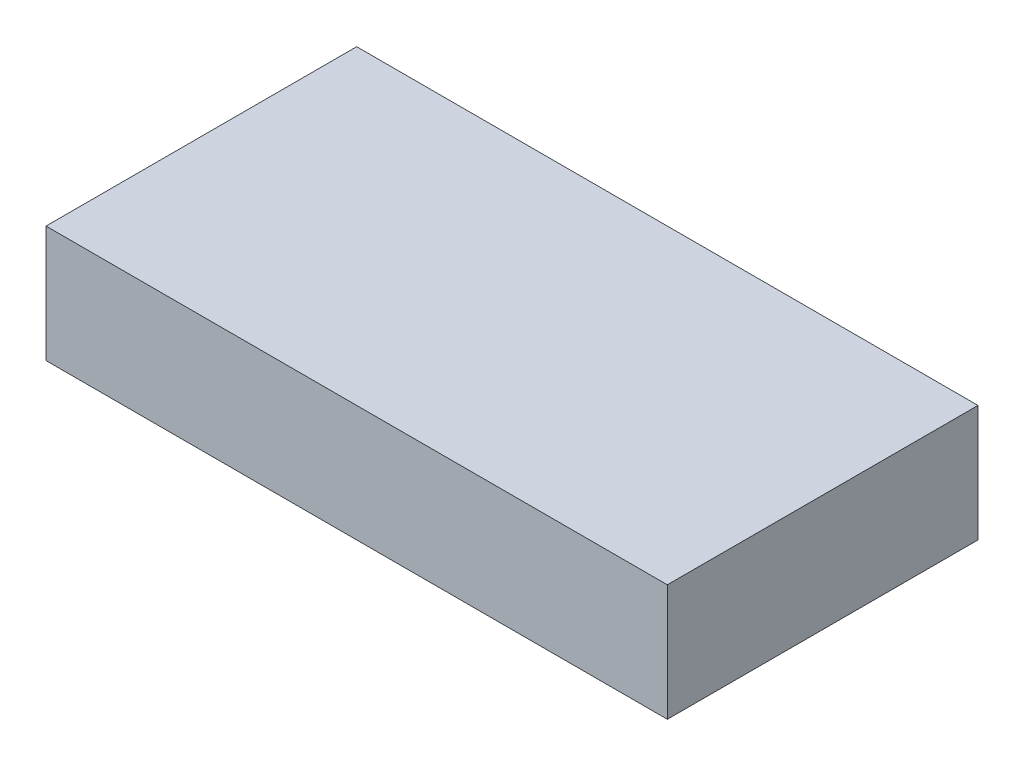
ISO-10303-21;
HEADER;
FILE_DESCRIPTION(('STEP AP214'),'2;1');
FILE_NAME('part.step','',(''),(''),'','','');
FILE_SCHEMA(('AUTOMOTIVE_DESIGN { 1 0 10303 214 1 1 1 1 }'));
ENDSEC;
DATA;
#1=APPLICATION_CONTEXT('core data for automotive mechanical design processes');
#2=APPLICATION_PROTOCOL_DEFINITION('international standard','automotive_design',2000,#1);
#3=PRODUCT_CONTEXT('',#1,'mechanical');
#4=PRODUCT('Part','Part','',(#3));
#5=PRODUCT_RELATED_PRODUCT_CATEGORY('part','',(#4));
#6=PRODUCT_DEFINITION_FORMATION('','',#4);
#7=PRODUCT_DEFINITION_CONTEXT('part definition',#1,'design');
#8=PRODUCT_DEFINITION('design','',#6,#7);
#9=PRODUCT_DEFINITION_SHAPE('','',#8);
#10=(LENGTH_UNIT() NAMED_UNIT(*) SI_UNIT(.MILLI.,.METRE.));
#11=(NAMED_UNIT(*) PLANE_ANGLE_UNIT() SI_UNIT($,.RADIAN.));
#12=(NAMED_UNIT(*) SI_UNIT($,.STERADIAN.) SOLID_ANGLE_UNIT());
#13=UNCERTAINTY_MEASURE_WITH_UNIT(LENGTH_MEASURE(1.E-05),#10,'distance_accuracy_value','');
#14=(GEOMETRIC_REPRESENTATION_CONTEXT(3) GLOBAL_UNCERTAINTY_ASSIGNED_CONTEXT((#13)) GLOBAL_UNIT_ASSIGNED_CONTEXT((#10,
#11,#12)) REPRESENTATION_CONTEXT('',''));
#15=CARTESIAN_POINT('',(0.,0.,0.));
#16=DIRECTION('',(0.,0.,1.));
#17=DIRECTION('',(1.,0.,0.));
#18=AXIS2_PLACEMENT_3D('',#15,#16,#17);
#19=CARTESIAN_POINT('',(0.,-19.05,0.));
#20=DIRECTION('',(-1.,0.,0.));
#21=DIRECTION('',(0.,0.,1.));
#22=AXIS2_PLACEMENT_3D('',#19,#20,#21);
#23=PLANE('',#22);
#24=DIRECTION('',(0.,0.,1.));
#25=VECTOR('',#24,1.);
#26=CARTESIAN_POINT('',(0.,0.,0.));
#27=LINE('',#26,#25);
#28=CARTESIAN_POINT('',(0.,0.,-50.8));
#29=VERTEX_POINT('',#28);
#30=CARTESIAN_POINT('',(0.,0.,0.));
#31=VERTEX_POINT('',#30);
#32=EDGE_CURVE('E95',#29,#31,#27,.T.);
#33=ORIENTED_EDGE('',*,*,#32,.F.);
#34=DIRECTION('',(0.,1.,0.));
#35=VECTOR('',#34,1.);
#36=CARTESIAN_POINT('',(0.,-19.05,-50.8));
#37=LINE('',#36,#35);
#38=CARTESIAN_POINT('',(0.,-19.05,-50.8));
#39=VERTEX_POINT('',#38);
#40=EDGE_CURVE('E11',#39,#29,#37,.T.);
#41=ORIENTED_EDGE('',*,*,#40,.F.);
#42=DIRECTION('',(0.,0.,1.));
#43=VECTOR('',#42,1.);
#44=CARTESIAN_POINT('',(0.,-19.05,0.));
#45=LINE('',#44,#43);
#46=CARTESIAN_POINT('',(0.,-19.05,0.));
#47=VERTEX_POINT('',#46);
#48=EDGE_CURVE('E89',#39,#47,#45,.T.);
#49=ORIENTED_EDGE('',*,*,#48,.T.);
#50=DIRECTION('',(0.,1.,0.));
#51=VECTOR('',#50,1.);
#52=CARTESIAN_POINT('',(0.,-19.05,0.));
#53=LINE('',#52,#51);
#54=EDGE_CURVE('E34',#47,#31,#53,.T.);
#55=ORIENTED_EDGE('',*,*,#54,.T.);
#56=EDGE_LOOP('',(#33,#41,#49,#55));
#57=FACE_BOUND('',#56,.T.);
#58=ADVANCED_FACE('F31',(#57),#23,.T.);
#59=CARTESIAN_POINT('',(0.,-19.05,-50.8));
#60=DIRECTION('',(0.,0.,-1.));
#61=DIRECTION('',(-1.,0.,0.));
#62=AXIS2_PLACEMENT_3D('',#59,#60,#61);
#63=PLANE('',#62);
#64=DIRECTION('',(-1.,0.,0.));
#65=VECTOR('',#64,1.);
#66=CARTESIAN_POINT('',(0.,0.,-50.8));
#67=LINE('',#66,#65);
#68=CARTESIAN_POINT('',(101.6,0.,-50.8));
#69=VERTEX_POINT('',#68);
#70=EDGE_CURVE('E91',#69,#29,#67,.T.);
#71=ORIENTED_EDGE('',*,*,#70,.F.);
#72=DIRECTION('',(0.,1.,0.));
#73=VECTOR('',#72,1.);
#74=CARTESIAN_POINT('',(101.6,-19.05,-50.8));
#75=LINE('',#74,#73);
#76=CARTESIAN_POINT('',(101.6,-19.05,-50.8));
#77=VERTEX_POINT('',#76);
#78=EDGE_CURVE('E40',#77,#69,#75,.T.);
#79=ORIENTED_EDGE('',*,*,#78,.F.);
#80=DIRECTION('',(-1.,0.,0.));
#81=VECTOR('',#80,1.);
#82=CARTESIAN_POINT('',(0.,-19.05,-50.8));
#83=LINE('',#82,#81);
#84=EDGE_CURVE('E86',#77,#39,#83,.T.);
#85=ORIENTED_EDGE('',*,*,#84,.T.);
#86=ORIENTED_EDGE('',*,*,#40,.T.);
#87=EDGE_LOOP('',(#71,#79,#85,#86));
#88=FACE_BOUND('',#87,.T.);
#89=ADVANCED_FACE('F105',(#88),#63,.T.);
#90=CARTESIAN_POINT('',(101.6,-19.05,0.));
#91=DIRECTION('',(1.,0.,0.));
#92=DIRECTION('',(0.,0.,-1.));
#93=AXIS2_PLACEMENT_3D('',#90,#91,#92);
#94=PLANE('',#93);
#95=DIRECTION('',(0.,0.,-1.));
#96=VECTOR('',#95,1.);
#97=CARTESIAN_POINT('',(101.6,0.,0.));
#98=LINE('',#97,#96);
#99=CARTESIAN_POINT('',(101.6,0.,0.));
#100=VERTEX_POINT('',#99);
#101=EDGE_CURVE('E81',#100,#69,#98,.T.);
#102=ORIENTED_EDGE('',*,*,#101,.F.);
#103=DIRECTION('',(0.,1.,0.));
#104=VECTOR('',#103,1.);
#105=CARTESIAN_POINT('',(101.6,-19.05,0.));
#106=LINE('',#105,#104);
#107=CARTESIAN_POINT('',(101.6,-19.05,0.));
#108=VERTEX_POINT('',#107);
#109=EDGE_CURVE('E76',#108,#100,#106,.T.);
#110=ORIENTED_EDGE('',*,*,#109,.F.);
#111=DIRECTION('',(0.,0.,-1.));
#112=VECTOR('',#111,1.);
#113=CARTESIAN_POINT('',(101.6,-19.05,0.));
#114=LINE('',#113,#112);
#115=EDGE_CURVE('E79',#108,#77,#114,.T.);
#116=ORIENTED_EDGE('',*,*,#115,.T.);
#117=ORIENTED_EDGE('',*,*,#78,.T.);
#118=EDGE_LOOP('',(#102,#110,#116,#117));
#119=FACE_BOUND('',#118,.T.);
#120=ADVANCED_FACE('F78',(#119),#94,.T.);
#121=CARTESIAN_POINT('',(0.,-19.05,0.));
#122=DIRECTION('',(0.,0.,1.));
#123=DIRECTION('',(1.,0.,0.));
#124=AXIS2_PLACEMENT_3D('',#121,#122,#123);
#125=PLANE('',#124);
#126=DIRECTION('',(1.,0.,0.));
#127=VECTOR('',#126,1.);
#128=CARTESIAN_POINT('',(0.,0.,0.));
#129=LINE('',#128,#127);
#130=EDGE_CURVE('E98',#31,#100,#129,.T.);
#131=ORIENTED_EDGE('',*,*,#130,.F.);
#132=ORIENTED_EDGE('',*,*,#54,.F.);
#133=DIRECTION('',(1.,0.,0.));
#134=VECTOR('',#133,1.);
#135=CARTESIAN_POINT('',(0.,-19.05,0.));
#136=LINE('',#135,#134);
#137=EDGE_CURVE('E85',#47,#108,#136,.T.);
#138=ORIENTED_EDGE('',*,*,#137,.T.);
#139=ORIENTED_EDGE('',*,*,#109,.T.);
#140=EDGE_LOOP('',(#131,#132,#138,#139));
#141=FACE_BOUND('',#140,.T.);
#142=ADVANCED_FACE('F88',(#141),#125,.T.);
#143=CARTESIAN_POINT('',(0.,-19.05,-50.8));
#144=DIRECTION('',(0.,-1.,0.));
#145=DIRECTION('',(0.,0.,-1.));
#146=AXIS2_PLACEMENT_3D('',#143,#144,#145);
#147=PLANE('',#146);
#148=ORIENTED_EDGE('',*,*,#48,.F.);
#149=ORIENTED_EDGE('',*,*,#84,.F.);
#150=ORIENTED_EDGE('',*,*,#115,.F.);
#151=ORIENTED_EDGE('',*,*,#137,.F.);
#152=EDGE_LOOP('',(#148,#149,#150,#151));
#153=FACE_BOUND('',#152,.T.);
#154=ADVANCED_FACE('F84',(#153),#147,.T.);
#155=CARTESIAN_POINT('',(0.,0.,-50.8));
#156=DIRECTION('',(0.,-1.,0.));
#157=DIRECTION('',(0.,0.,-1.));
#158=AXIS2_PLACEMENT_3D('',#155,#156,#157);
#159=PLANE('',#158);
#160=ORIENTED_EDGE('',*,*,#32,.T.);
#161=ORIENTED_EDGE('',*,*,#130,.T.);
#162=ORIENTED_EDGE('',*,*,#101,.T.);
#163=ORIENTED_EDGE('',*,*,#70,.T.);
#164=EDGE_LOOP('',(#160,#161,#162,#163));
#165=FACE_BOUND('',#164,.T.);
#166=ADVANCED_FACE('F104',(#165),#159,.F.);
#167=CLOSED_SHELL('',(#58,#89,#120,#142,#154,#166));
#168=MANIFOLD_SOLID_BREP('B2',#167);
#169=ADVANCED_BREP_SHAPE_REPRESENTATION('',(#18,#168),#14);
#170=SHAPE_DEFINITION_REPRESENTATION(#9,#169);
ENDSEC;
END-ISO-10303-21;
